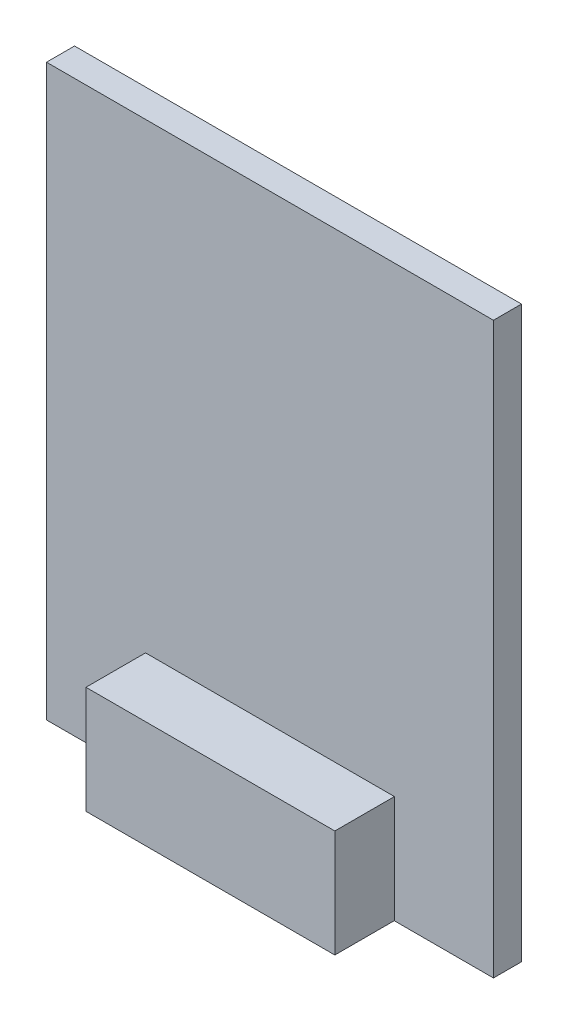
ISO-10303-21;
HEADER;
FILE_DESCRIPTION(('STEP AP214'),'2;1');
FILE_NAME('part.step','',(''),(''),'','','');
FILE_SCHEMA(('AUTOMOTIVE_DESIGN { 1 0 10303 214 1 1 1 1 }'));
ENDSEC;
DATA;
#1=APPLICATION_CONTEXT('core data for automotive mechanical design processes');
#2=APPLICATION_PROTOCOL_DEFINITION('international standard','automotive_design',2000,#1);
#3=PRODUCT_CONTEXT('',#1,'mechanical');
#4=PRODUCT('Part','Part','',(#3));
#5=PRODUCT_RELATED_PRODUCT_CATEGORY('part','',(#4));
#6=PRODUCT_DEFINITION_FORMATION('','',#4);
#7=PRODUCT_DEFINITION_CONTEXT('part definition',#1,'design');
#8=PRODUCT_DEFINITION('design','',#6,#7);
#9=PRODUCT_DEFINITION_SHAPE('','',#8);
#10=(LENGTH_UNIT() NAMED_UNIT(*) SI_UNIT(.MILLI.,.METRE.));
#11=(NAMED_UNIT(*) PLANE_ANGLE_UNIT() SI_UNIT($,.RADIAN.));
#12=(NAMED_UNIT(*) SI_UNIT($,.STERADIAN.) SOLID_ANGLE_UNIT());
#13=UNCERTAINTY_MEASURE_WITH_UNIT(LENGTH_MEASURE(1.E-05),#10,'distance_accuracy_value','');
#14=(GEOMETRIC_REPRESENTATION_CONTEXT(3) GLOBAL_UNCERTAINTY_ASSIGNED_CONTEXT((#13)) GLOBAL_UNIT_ASSIGNED_CONTEXT((#10,
#11,#12)) REPRESENTATION_CONTEXT('',''));
#15=CARTESIAN_POINT('',(0.,0.,0.));
#16=DIRECTION('',(0.,0.,1.));
#17=DIRECTION('',(1.,0.,0.));
#18=AXIS2_PLACEMENT_3D('',#15,#16,#17);
#19=CARTESIAN_POINT('',(0.,0.,1.6));
#20=DIRECTION('',(0.,0.,1.));
#21=DIRECTION('',(1.,0.,0.));
#22=AXIS2_PLACEMENT_3D('',#19,#20,#21);
#23=PLANE('',#22);
#24=DIRECTION('',(0.,1.,0.));
#25=VECTOR('',#24,1.);
#26=CARTESIAN_POINT('',(12.75,16.25,1.6));
#27=LINE('',#26,#25);
#28=CARTESIAN_POINT('',(12.75,-16.25,1.6));
#29=VERTEX_POINT('',#28);
#30=CARTESIAN_POINT('',(12.75,16.25,1.6));
#31=VERTEX_POINT('',#30);
#32=EDGE_CURVE('E147',#29,#31,#27,.T.);
#33=ORIENTED_EDGE('',*,*,#32,.T.);
#34=DIRECTION('',(-1.,0.,0.));
#35=VECTOR('',#34,1.);
#36=CARTESIAN_POINT('',(-12.75,16.25,1.6));
#37=LINE('',#36,#35);
#38=CARTESIAN_POINT('',(-12.75,16.25,1.6));
#39=VERTEX_POINT('',#38);
#40=EDGE_CURVE('E87',#31,#39,#37,.T.);
#41=ORIENTED_EDGE('',*,*,#40,.T.);
#42=DIRECTION('',(0.,-1.,0.));
#43=VECTOR('',#42,1.);
#44=CARTESIAN_POINT('',(-12.75,16.25,1.6));
#45=LINE('',#44,#43);
#46=CARTESIAN_POINT('',(-12.75,-16.25,1.6));
#47=VERTEX_POINT('',#46);
#48=EDGE_CURVE('E150',#39,#47,#45,.T.);
#49=ORIENTED_EDGE('',*,*,#48,.T.);
#50=DIRECTION('',(1.,0.,0.));
#51=VECTOR('',#50,1.);
#52=CARTESIAN_POINT('',(-12.75,-16.25,1.6));
#53=LINE('',#52,#51);
#54=EDGE_CURVE('E59',#47,#29,#53,.T.);
#55=ORIENTED_EDGE('',*,*,#54,.T.);
#56=EDGE_LOOP('',(#33,#41,#49,#55));
#57=FACE_BOUND('',#56,.T.);
#58=DIRECTION('',(-1.,0.,0.));
#59=VECTOR('',#58,1.);
#60=CARTESIAN_POINT('',(0.,-16.24,1.6));
#61=LINE('',#60,#59);
#62=CARTESIAN_POINT('',(7.1,-16.24,1.6));
#63=VERTEX_POINT('',#62);
#64=CARTESIAN_POINT('',(-7.1,-16.24,1.6));
#65=VERTEX_POINT('',#64);
#66=EDGE_CURVE('E143',#63,#65,#61,.T.);
#67=ORIENTED_EDGE('',*,*,#66,.T.);
#68=DIRECTION('',(0.,1.,0.));
#69=VECTOR('',#68,1.);
#70=CARTESIAN_POINT('',(-7.09999999999999,0.,1.6));
#71=LINE('',#70,#69);
#72=CARTESIAN_POINT('',(-7.1,-10.11,1.6));
#73=VERTEX_POINT('',#72);
#74=EDGE_CURVE('E132',#65,#73,#71,.T.);
#75=ORIENTED_EDGE('',*,*,#74,.T.);
#76=DIRECTION('',(1.,0.,0.));
#77=VECTOR('',#76,1.);
#78=CARTESIAN_POINT('',(0.,-10.11,1.6));
#79=LINE('',#78,#77);
#80=CARTESIAN_POINT('',(7.1,-10.11,1.6));
#81=VERTEX_POINT('',#80);
#82=EDGE_CURVE('E133',#73,#81,#79,.T.);
#83=ORIENTED_EDGE('',*,*,#82,.T.);
#84=DIRECTION('',(0.,-1.,0.));
#85=VECTOR('',#84,1.);
#86=CARTESIAN_POINT('',(7.1,0.,1.6));
#87=LINE('',#86,#85);
#88=EDGE_CURVE('E136',#81,#63,#87,.T.);
#89=ORIENTED_EDGE('',*,*,#88,.T.);
#90=EDGE_LOOP('',(#67,#75,#83,#89));
#91=FACE_BOUND('',#90,.T.);
#92=ADVANCED_FACE('F35',(#57,#91),#23,.T.);
#93=CARTESIAN_POINT('',(12.75,16.25,1.6));
#94=DIRECTION('',(-1.,0.,0.));
#95=DIRECTION('',(0.,-1.,0.));
#96=AXIS2_PLACEMENT_3D('',#93,#94,#95);
#97=PLANE('',#96);
#98=DIRECTION('',(0.,1.,0.));
#99=VECTOR('',#98,1.);
#100=CARTESIAN_POINT('',(12.75,16.25,0.));
#101=LINE('',#100,#99);
#102=CARTESIAN_POINT('',(12.75,-16.25,0.));
#103=VERTEX_POINT('',#102);
#104=CARTESIAN_POINT('',(12.75,16.25,0.));
#105=VERTEX_POINT('',#104);
#106=EDGE_CURVE('E146',#103,#105,#101,.T.);
#107=ORIENTED_EDGE('',*,*,#106,.T.);
#108=DIRECTION('',(0.,0.,-1.));
#109=VECTOR('',#108,1.);
#110=CARTESIAN_POINT('',(12.75,16.25,1.6));
#111=LINE('',#110,#109);
#112=EDGE_CURVE('E11',#31,#105,#111,.T.);
#113=ORIENTED_EDGE('',*,*,#112,.F.);
#114=ORIENTED_EDGE('',*,*,#32,.F.);
#115=DIRECTION('',(0.,0.,-1.));
#116=VECTOR('',#115,1.);
#117=CARTESIAN_POINT('',(12.75,-16.25,1.6));
#118=LINE('',#117,#116);
#119=EDGE_CURVE('E153',#29,#103,#118,.T.);
#120=ORIENTED_EDGE('',*,*,#119,.T.);
#121=EDGE_LOOP('',(#107,#113,#114,#120));
#122=FACE_BOUND('',#121,.T.);
#123=ADVANCED_FACE('F37',(#122),#97,.F.);
#124=CARTESIAN_POINT('',(-12.75,16.25,1.6));
#125=DIRECTION('',(0.,-1.,0.));
#126=DIRECTION('',(0.,0.,-1.));
#127=AXIS2_PLACEMENT_3D('',#124,#125,#126);
#128=PLANE('',#127);
#129=DIRECTION('',(-1.,0.,0.));
#130=VECTOR('',#129,1.);
#131=CARTESIAN_POINT('',(-12.75,16.25,0.));
#132=LINE('',#131,#130);
#133=CARTESIAN_POINT('',(-12.75,16.25,0.));
#134=VERTEX_POINT('',#133);
#135=EDGE_CURVE('E156',#105,#134,#132,.T.);
#136=ORIENTED_EDGE('',*,*,#135,.T.);
#137=DIRECTION('',(0.,0.,-1.));
#138=VECTOR('',#137,1.);
#139=CARTESIAN_POINT('',(-12.75,16.25,1.6));
#140=LINE('',#139,#138);
#141=EDGE_CURVE('E43',#39,#134,#140,.T.);
#142=ORIENTED_EDGE('',*,*,#141,.F.);
#143=ORIENTED_EDGE('',*,*,#40,.F.);
#144=ORIENTED_EDGE('',*,*,#112,.T.);
#145=EDGE_LOOP('',(#136,#142,#143,#144));
#146=FACE_BOUND('',#145,.T.);
#147=ADVANCED_FACE('F183',(#146),#128,.F.);
#148=CARTESIAN_POINT('',(-12.75,16.25,1.6));
#149=DIRECTION('',(1.,0.,0.));
#150=DIRECTION('',(0.,1.,0.));
#151=AXIS2_PLACEMENT_3D('',#148,#149,#150);
#152=PLANE('',#151);
#153=DIRECTION('',(0.,-1.,0.));
#154=VECTOR('',#153,1.);
#155=CARTESIAN_POINT('',(-12.75,16.25,0.));
#156=LINE('',#155,#154);
#157=CARTESIAN_POINT('',(-12.75,-16.25,0.));
#158=VERTEX_POINT('',#157);
#159=EDGE_CURVE('E158',#134,#158,#156,.T.);
#160=ORIENTED_EDGE('',*,*,#159,.T.);
#161=DIRECTION('',(0.,0.,-1.));
#162=VECTOR('',#161,1.);
#163=CARTESIAN_POINT('',(-12.75,-16.25,1.6));
#164=LINE('',#163,#162);
#165=EDGE_CURVE('E162',#47,#158,#164,.T.);
#166=ORIENTED_EDGE('',*,*,#165,.F.);
#167=ORIENTED_EDGE('',*,*,#48,.F.);
#168=ORIENTED_EDGE('',*,*,#141,.T.);
#169=EDGE_LOOP('',(#160,#166,#167,#168));
#170=FACE_BOUND('',#169,.T.);
#171=ADVANCED_FACE('F167',(#170),#152,.F.);
#172=CARTESIAN_POINT('',(-12.75,-16.25,1.6));
#173=DIRECTION('',(0.,1.,0.));
#174=DIRECTION('',(0.,0.,1.));
#175=AXIS2_PLACEMENT_3D('',#172,#173,#174);
#176=PLANE('',#175);
#177=DIRECTION('',(1.,0.,0.));
#178=VECTOR('',#177,1.);
#179=CARTESIAN_POINT('',(-12.75,-16.25,0.));
#180=LINE('',#179,#178);
#181=EDGE_CURVE('E80',#158,#103,#180,.T.);
#182=ORIENTED_EDGE('',*,*,#181,.T.);
#183=ORIENTED_EDGE('',*,*,#119,.F.);
#184=ORIENTED_EDGE('',*,*,#54,.F.);
#185=ORIENTED_EDGE('',*,*,#165,.T.);
#186=EDGE_LOOP('',(#182,#183,#184,#185));
#187=FACE_BOUND('',#186,.T.);
#188=ADVANCED_FACE('F175',(#187),#176,.F.);
#189=CARTESIAN_POINT('',(0.,0.,0.));
#190=DIRECTION('',(0.,0.,1.));
#191=DIRECTION('',(1.,0.,0.));
#192=AXIS2_PLACEMENT_3D('',#189,#190,#191);
#193=PLANE('',#192);
#194=ORIENTED_EDGE('',*,*,#106,.F.);
#195=ORIENTED_EDGE('',*,*,#181,.F.);
#196=ORIENTED_EDGE('',*,*,#159,.F.);
#197=ORIENTED_EDGE('',*,*,#135,.F.);
#198=EDGE_LOOP('',(#194,#195,#196,#197));
#199=FACE_BOUND('',#198,.T.);
#200=ADVANCED_FACE('F171',(#199),#193,.F.);
#201=CARTESIAN_POINT('',(-7.1,-10.11,5.));
#202=DIRECTION('',(1.,0.,0.));
#203=DIRECTION('',(0.,1.,0.));
#204=AXIS2_PLACEMENT_3D('',#201,#202,#203);
#205=PLANE('',#204);
#206=ORIENTED_EDGE('',*,*,#74,.F.);
#207=DIRECTION('',(0.,0.,-1.));
#208=VECTOR('',#207,1.);
#209=CARTESIAN_POINT('',(-7.1,-16.24,5.));
#210=LINE('',#209,#208);
#211=CARTESIAN_POINT('',(-7.1,-16.24,5.));
#212=VERTEX_POINT('',#211);
#213=EDGE_CURVE('E114',#212,#65,#210,.T.);
#214=ORIENTED_EDGE('',*,*,#213,.F.);
#215=DIRECTION('',(0.,-1.,0.));
#216=VECTOR('',#215,1.);
#217=CARTESIAN_POINT('',(-7.1,-10.11,5.));
#218=LINE('',#217,#216);
#219=CARTESIAN_POINT('',(-7.1,-10.11,5.));
#220=VERTEX_POINT('',#219);
#221=EDGE_CURVE('E121',#220,#212,#218,.T.);
#222=ORIENTED_EDGE('',*,*,#221,.F.);
#223=DIRECTION('',(0.,0.,-1.));
#224=VECTOR('',#223,1.);
#225=CARTESIAN_POINT('',(-7.1,-10.11,5.));
#226=LINE('',#225,#224);
#227=EDGE_CURVE('E267',#220,#73,#226,.T.);
#228=ORIENTED_EDGE('',*,*,#227,.T.);
#229=EDGE_LOOP('',(#206,#214,#222,#228));
#230=FACE_BOUND('',#229,.T.);
#231=ADVANCED_FACE('F130',(#230),#205,.F.);
#232=CARTESIAN_POINT('',(-7.1,-16.24,5.));
#233=DIRECTION('',(0.,1.,0.));
#234=DIRECTION('',(0.,0.,1.));
#235=AXIS2_PLACEMENT_3D('',#232,#233,#234);
#236=PLANE('',#235);
#237=ORIENTED_EDGE('',*,*,#66,.F.);
#238=DIRECTION('',(0.,0.,-1.));
#239=VECTOR('',#238,1.);
#240=CARTESIAN_POINT('',(7.1,-16.24,5.));
#241=LINE('',#240,#239);
#242=CARTESIAN_POINT('',(7.1,-16.24,5.));
#243=VERTEX_POINT('',#242);
#244=EDGE_CURVE('E117',#243,#63,#241,.T.);
#245=ORIENTED_EDGE('',*,*,#244,.F.);
#246=DIRECTION('',(1.,0.,0.));
#247=VECTOR('',#246,1.);
#248=CARTESIAN_POINT('',(-7.1,-16.24,5.));
#249=LINE('',#248,#247);
#250=EDGE_CURVE('E110',#212,#243,#249,.T.);
#251=ORIENTED_EDGE('',*,*,#250,.F.);
#252=ORIENTED_EDGE('',*,*,#213,.T.);
#253=EDGE_LOOP('',(#237,#245,#251,#252));
#254=FACE_BOUND('',#253,.T.);
#255=ADVANCED_FACE('F112',(#254),#236,.F.);
#256=CARTESIAN_POINT('',(7.1,-10.11,5.));
#257=DIRECTION('',(-1.,0.,0.));
#258=DIRECTION('',(0.,0.,1.));
#259=AXIS2_PLACEMENT_3D('',#256,#257,#258);
#260=PLANE('',#259);
#261=ORIENTED_EDGE('',*,*,#88,.F.);
#262=DIRECTION('',(0.,0.,-1.));
#263=VECTOR('',#262,1.);
#264=CARTESIAN_POINT('',(7.1,-10.11,5.));
#265=LINE('',#264,#263);
#266=CARTESIAN_POINT('',(7.1,-10.11,5.));
#267=VERTEX_POINT('',#266);
#268=EDGE_CURVE('E50',#267,#81,#265,.T.);
#269=ORIENTED_EDGE('',*,*,#268,.F.);
#270=DIRECTION('',(0.,1.,0.));
#271=VECTOR('',#270,1.);
#272=CARTESIAN_POINT('',(7.1,-10.11,5.));
#273=LINE('',#272,#271);
#274=EDGE_CURVE('E120',#243,#267,#273,.T.);
#275=ORIENTED_EDGE('',*,*,#274,.F.);
#276=ORIENTED_EDGE('',*,*,#244,.T.);
#277=EDGE_LOOP('',(#261,#269,#275,#276));
#278=FACE_BOUND('',#277,.T.);
#279=ADVANCED_FACE('F196',(#278),#260,.F.);
#280=CARTESIAN_POINT('',(-7.1,-10.11,5.));
#281=DIRECTION('',(0.,-1.,0.));
#282=DIRECTION('',(0.,0.,-1.));
#283=AXIS2_PLACEMENT_3D('',#280,#281,#282);
#284=PLANE('',#283);
#285=ORIENTED_EDGE('',*,*,#82,.F.);
#286=ORIENTED_EDGE('',*,*,#227,.F.);
#287=DIRECTION('',(-1.,0.,0.));
#288=VECTOR('',#287,1.);
#289=CARTESIAN_POINT('',(-7.1,-10.11,5.));
#290=LINE('',#289,#288);
#291=EDGE_CURVE('E125',#267,#220,#290,.T.);
#292=ORIENTED_EDGE('',*,*,#291,.F.);
#293=ORIENTED_EDGE('',*,*,#268,.T.);
#294=EDGE_LOOP('',(#285,#286,#292,#293));
#295=FACE_BOUND('',#294,.T.);
#296=ADVANCED_FACE('F199',(#295),#284,.F.);
#297=CARTESIAN_POINT('',(0.,0.,5.));
#298=DIRECTION('',(0.,0.,1.));
#299=DIRECTION('',(1.,0.,0.));
#300=AXIS2_PLACEMENT_3D('',#297,#298,#299);
#301=PLANE('',#300);
#302=ORIENTED_EDGE('',*,*,#221,.T.);
#303=ORIENTED_EDGE('',*,*,#250,.T.);
#304=ORIENTED_EDGE('',*,*,#274,.T.);
#305=ORIENTED_EDGE('',*,*,#291,.T.);
#306=EDGE_LOOP('',(#302,#303,#304,#305));
#307=FACE_BOUND('',#306,.T.);
#308=ADVANCED_FACE('F124',(#307),#301,.T.);
#309=CLOSED_SHELL('',(#92,#123,#147,#171,#188,#200,#231,#255,#279,#296,#308));
#310=MANIFOLD_SOLID_BREP('B2',#309);
#311=ADVANCED_BREP_SHAPE_REPRESENTATION('',(#18,#310),#14);
#312=SHAPE_DEFINITION_REPRESENTATION(#9,#311);
ENDSEC;
END-ISO-10303-21;
